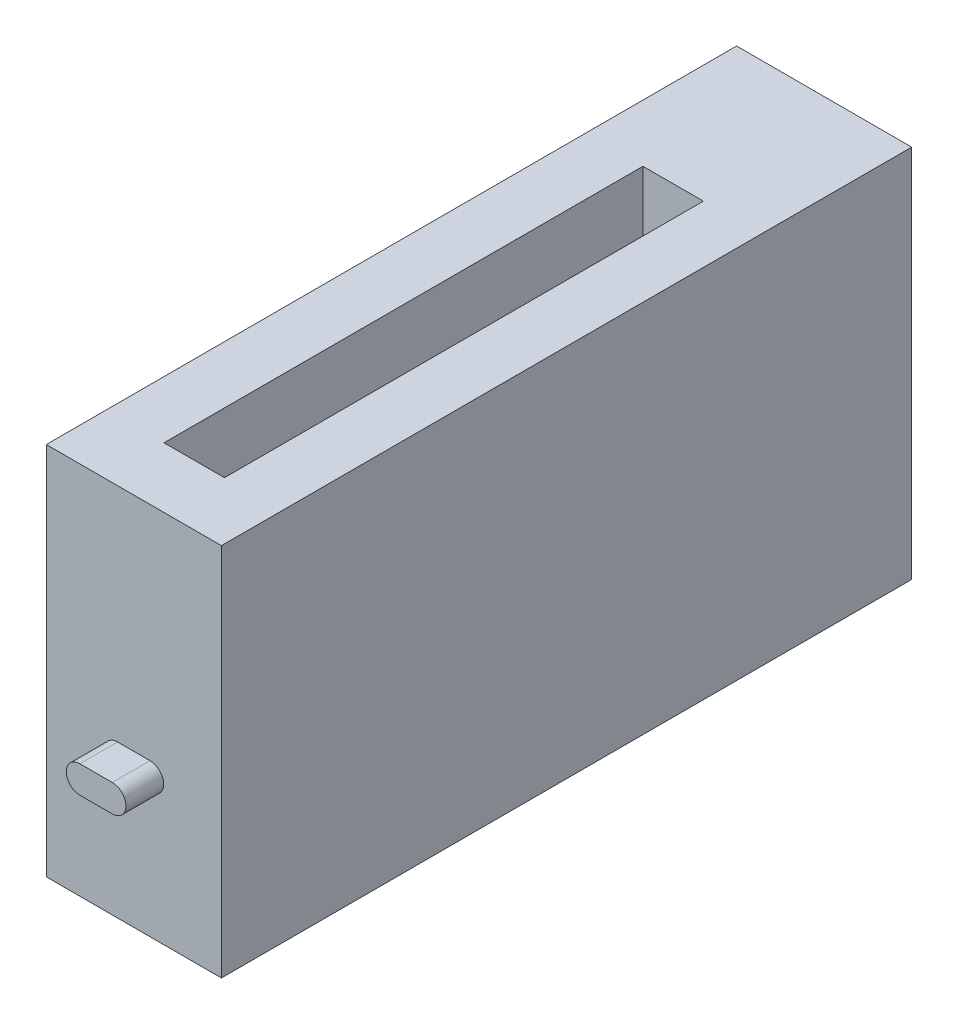
ISO-10303-21;
HEADER;
FILE_DESCRIPTION(('STEP AP214'),'2;1');
FILE_NAME('part.step','',(''),(''),'','','');
FILE_SCHEMA(('AUTOMOTIVE_DESIGN { 1 0 10303 214 1 1 1 1 }'));
ENDSEC;
DATA;
#1=APPLICATION_CONTEXT('core data for automotive mechanical design processes');
#2=APPLICATION_PROTOCOL_DEFINITION('international standard','automotive_design',2000,#1);
#3=PRODUCT_CONTEXT('',#1,'mechanical');
#4=PRODUCT('Part','Part','',(#3));
#5=PRODUCT_RELATED_PRODUCT_CATEGORY('part','',(#4));
#6=PRODUCT_DEFINITION_FORMATION('','',#4);
#7=PRODUCT_DEFINITION_CONTEXT('part definition',#1,'design');
#8=PRODUCT_DEFINITION('design','',#6,#7);
#9=PRODUCT_DEFINITION_SHAPE('','',#8);
#10=(LENGTH_UNIT() NAMED_UNIT(*) SI_UNIT(.MILLI.,.METRE.));
#11=(NAMED_UNIT(*) PLANE_ANGLE_UNIT() SI_UNIT($,.RADIAN.));
#12=(NAMED_UNIT(*) SI_UNIT($,.STERADIAN.) SOLID_ANGLE_UNIT());
#13=UNCERTAINTY_MEASURE_WITH_UNIT(LENGTH_MEASURE(1.E-05),#10,'distance_accuracy_value','');
#14=(GEOMETRIC_REPRESENTATION_CONTEXT(3) GLOBAL_UNCERTAINTY_ASSIGNED_CONTEXT((#13)) GLOBAL_UNIT_ASSIGNED_CONTEXT((#10,
#11,#12)) REPRESENTATION_CONTEXT('',''));
#15=CARTESIAN_POINT('',(0.,0.,0.));
#16=DIRECTION('',(0.,0.,1.));
#17=DIRECTION('',(1.,0.,0.));
#18=AXIS2_PLACEMENT_3D('',#15,#16,#17);
#19=CARTESIAN_POINT('',(-3.683,15.748,14.5161));
#20=DIRECTION('',(0.,0.,-1.));
#21=DIRECTION('',(-1.,0.,0.));
#22=AXIS2_PLACEMENT_3D('',#19,#20,#21);
#23=PLANE('',#22);
#24=DIRECTION('',(1.,0.,0.));
#25=VECTOR('',#24,1.);
#26=CARTESIAN_POINT('',(-3.683,0.,14.5161));
#27=LINE('',#26,#25);
#28=CARTESIAN_POINT('',(-3.683,0.,14.5161));
#29=VERTEX_POINT('',#28);
#30=CARTESIAN_POINT('',(3.683,0.,14.5161));
#31=VERTEX_POINT('',#30);
#32=EDGE_CURVE('E187',#29,#31,#27,.T.);
#33=ORIENTED_EDGE('',*,*,#32,.T.);
#34=DIRECTION('',(0.,-1.,0.));
#35=VECTOR('',#34,1.);
#36=CARTESIAN_POINT('',(3.683,15.748,14.5161));
#37=LINE('',#36,#35);
#38=CARTESIAN_POINT('',(3.683,15.748,14.5161));
#39=VERTEX_POINT('',#38);
#40=EDGE_CURVE('E193',#39,#31,#37,.T.);
#41=ORIENTED_EDGE('',*,*,#40,.F.);
#42=DIRECTION('',(1.,0.,0.));
#43=VECTOR('',#42,1.);
#44=CARTESIAN_POINT('',(-3.683,15.748,14.5161));
#45=LINE('',#44,#43);
#46=CARTESIAN_POINT('',(-3.683,15.748,14.5161));
#47=VERTEX_POINT('',#46);
#48=EDGE_CURVE('E191',#47,#39,#45,.T.);
#49=ORIENTED_EDGE('',*,*,#48,.F.);
#50=DIRECTION('',(0.,-1.,0.));
#51=VECTOR('',#50,1.);
#52=CARTESIAN_POINT('',(-3.683,15.748,14.5161));
#53=LINE('',#52,#51);
#54=EDGE_CURVE('E203',#47,#29,#53,.T.);
#55=ORIENTED_EDGE('',*,*,#54,.T.);
#56=EDGE_LOOP('',(#33,#41,#49,#55));
#57=FACE_BOUND('',#56,.T.);
#58=CARTESIAN_POINT('',(-0.682666256929174,5.842,14.5161));
#59=DIRECTION('',(0.,0.,1.));
#60=DIRECTION('',(1.,0.,0.));
#61=AXIS2_PLACEMENT_3D('',#58,#59,#60);
#62=CIRCLE('',#61,0.572003725186661);
#63=CARTESIAN_POINT('',(-0.682666256929174,6.41400372518666,14.5161));
#64=VERTEX_POINT('',#63);
#65=CARTESIAN_POINT('',(-0.682666256929174,5.26999627481334,14.5161));
#66=VERTEX_POINT('',#65);
#67=EDGE_CURVE('E144',#64,#66,#62,.T.);
#68=ORIENTED_EDGE('',*,*,#67,.F.);
#69=DIRECTION('',(-1.,0.,0.));
#70=VECTOR('',#69,1.);
#71=CARTESIAN_POINT('',(-0.682666256929174,6.41400372518666,14.5161));
#72=LINE('',#71,#70);
#73=CARTESIAN_POINT('',(0.682666256929174,6.41400372518666,14.5161));
#74=VERTEX_POINT('',#73);
#75=EDGE_CURVE('E141',#74,#64,#72,.T.);
#76=ORIENTED_EDGE('',*,*,#75,.F.);
#77=CARTESIAN_POINT('',(0.682666256929174,5.842,14.5161));
#78=DIRECTION('',(0.,0.,1.));
#79=DIRECTION('',(1.,0.,0.));
#80=AXIS2_PLACEMENT_3D('',#77,#78,#79);
#81=CIRCLE('',#80,0.572003725186661);
#82=CARTESIAN_POINT('',(0.682666256929174,5.26999627481334,14.5161));
#83=VERTEX_POINT('',#82);
#84=EDGE_CURVE('E55',#83,#74,#81,.T.);
#85=ORIENTED_EDGE('',*,*,#84,.F.);
#86=DIRECTION('',(1.,0.,0.));
#87=VECTOR('',#86,1.);
#88=CARTESIAN_POINT('',(-0.682666256929174,5.26999627481334,14.5161));
#89=LINE('',#88,#87);
#90=EDGE_CURVE('E50',#66,#83,#89,.T.);
#91=ORIENTED_EDGE('',*,*,#90,.F.);
#92=EDGE_LOOP('',(#68,#76,#85,#91));
#93=FACE_BOUND('',#92,.T.);
#94=ADVANCED_FACE('F35',(#57,#93),#23,.F.);
#95=CARTESIAN_POINT('',(3.683,15.748,14.5161));
#96=DIRECTION('',(-1.,0.,0.));
#97=DIRECTION('',(0.,0.,1.));
#98=AXIS2_PLACEMENT_3D('',#95,#96,#97);
#99=PLANE('',#98);
#100=DIRECTION('',(0.,0.,-1.));
#101=VECTOR('',#100,1.);
#102=CARTESIAN_POINT('',(3.683,0.,14.5161));
#103=LINE('',#102,#101);
#104=CARTESIAN_POINT('',(3.683,0.,-14.5161));
#105=VERTEX_POINT('',#104);
#106=EDGE_CURVE('E176',#31,#105,#103,.T.);
#107=ORIENTED_EDGE('',*,*,#106,.T.);
#108=DIRECTION('',(0.,-1.,0.));
#109=VECTOR('',#108,1.);
#110=CARTESIAN_POINT('',(3.683,15.748,-14.5161));
#111=LINE('',#110,#109);
#112=CARTESIAN_POINT('',(3.683,15.748,-14.5161));
#113=VERTEX_POINT('',#112);
#114=EDGE_CURVE('E11',#113,#105,#111,.T.);
#115=ORIENTED_EDGE('',*,*,#114,.F.);
#116=DIRECTION('',(0.,0.,-1.));
#117=VECTOR('',#116,1.);
#118=CARTESIAN_POINT('',(3.683,15.748,14.5161));
#119=LINE('',#118,#117);
#120=EDGE_CURVE('E183',#39,#113,#119,.T.);
#121=ORIENTED_EDGE('',*,*,#120,.F.);
#122=ORIENTED_EDGE('',*,*,#40,.T.);
#123=EDGE_LOOP('',(#107,#115,#121,#122));
#124=FACE_BOUND('',#123,.T.);
#125=ADVANCED_FACE('F37',(#124),#99,.F.);
#126=CARTESIAN_POINT('',(-3.683,15.748,-14.5161));
#127=DIRECTION('',(0.,0.,1.));
#128=DIRECTION('',(1.,0.,0.));
#129=AXIS2_PLACEMENT_3D('',#126,#127,#128);
#130=PLANE('',#129);
#131=DIRECTION('',(-1.,0.,0.));
#132=VECTOR('',#131,1.);
#133=CARTESIAN_POINT('',(-3.683,0.,-14.5161));
#134=LINE('',#133,#132);
#135=CARTESIAN_POINT('',(-3.683,0.,-14.5161));
#136=VERTEX_POINT('',#135);
#137=EDGE_CURVE('E196',#105,#136,#134,.T.);
#138=ORIENTED_EDGE('',*,*,#137,.T.);
#139=DIRECTION('',(0.,-1.,0.));
#140=VECTOR('',#139,1.);
#141=CARTESIAN_POINT('',(-3.683,15.748,-14.5161));
#142=LINE('',#141,#140);
#143=CARTESIAN_POINT('',(-3.683,15.748,-14.5161));
#144=VERTEX_POINT('',#143);
#145=EDGE_CURVE('E43',#144,#136,#142,.T.);
#146=ORIENTED_EDGE('',*,*,#145,.F.);
#147=DIRECTION('',(-1.,0.,0.));
#148=VECTOR('',#147,1.);
#149=CARTESIAN_POINT('',(-3.683,15.748,-14.5161));
#150=LINE('',#149,#148);
#151=EDGE_CURVE('E186',#113,#144,#150,.T.);
#152=ORIENTED_EDGE('',*,*,#151,.F.);
#153=ORIENTED_EDGE('',*,*,#114,.T.);
#154=EDGE_LOOP('',(#138,#146,#152,#153));
#155=FACE_BOUND('',#154,.T.);
#156=ADVANCED_FACE('F225',(#155),#130,.F.);
#157=CARTESIAN_POINT('',(-3.683,15.748,14.5161));
#158=DIRECTION('',(1.,0.,0.));
#159=DIRECTION('',(0.,0.,-1.));
#160=AXIS2_PLACEMENT_3D('',#157,#158,#159);
#161=PLANE('',#160);
#162=DIRECTION('',(0.,0.,1.));
#163=VECTOR('',#162,1.);
#164=CARTESIAN_POINT('',(-3.683,0.,14.5161));
#165=LINE('',#164,#163);
#166=EDGE_CURVE('E198',#136,#29,#165,.T.);
#167=ORIENTED_EDGE('',*,*,#166,.T.);
#168=ORIENTED_EDGE('',*,*,#54,.F.);
#169=DIRECTION('',(0.,0.,1.));
#170=VECTOR('',#169,1.);
#171=CARTESIAN_POINT('',(-3.683,15.748,14.5161));
#172=LINE('',#171,#170);
#173=EDGE_CURVE('E189',#144,#47,#172,.T.);
#174=ORIENTED_EDGE('',*,*,#173,.F.);
#175=ORIENTED_EDGE('',*,*,#145,.T.);
#176=EDGE_LOOP('',(#167,#168,#174,#175));
#177=FACE_BOUND('',#176,.T.);
#178=ADVANCED_FACE('F210',(#177),#161,.F.);
#179=CARTESIAN_POINT('',(0.,15.748,0.));
#180=DIRECTION('',(0.,-1.,0.));
#181=DIRECTION('',(0.,0.,-1.));
#182=AXIS2_PLACEMENT_3D('',#179,#180,#181);
#183=PLANE('',#182);
#184=DIRECTION('',(-1.,0.,0.));
#185=VECTOR('',#184,1.);
#186=CARTESIAN_POINT('',(-1.27,15.748,-8.1661));
#187=LINE('',#186,#185);
#188=CARTESIAN_POINT('',(1.27,15.748,-8.1661));
#189=VERTEX_POINT('',#188);
#190=CARTESIAN_POINT('',(-1.27,15.748,-8.1661));
#191=VERTEX_POINT('',#190);
#192=EDGE_CURVE('E147',#189,#191,#187,.T.);
#193=ORIENTED_EDGE('',*,*,#192,.F.);
#194=DIRECTION('',(0.,0.,-1.));
#195=VECTOR('',#194,1.);
#196=CARTESIAN_POINT('',(1.27,15.748,11.9761));
#197=LINE('',#196,#195);
#198=CARTESIAN_POINT('',(1.27,15.748,11.9761));
#199=VERTEX_POINT('',#198);
#200=EDGE_CURVE('E145',#199,#189,#197,.T.);
#201=ORIENTED_EDGE('',*,*,#200,.F.);
#202=DIRECTION('',(1.,0.,0.));
#203=VECTOR('',#202,1.);
#204=CARTESIAN_POINT('',(-1.27,15.748,11.9761));
#205=LINE('',#204,#203);
#206=CARTESIAN_POINT('',(-1.27,15.748,11.9761));
#207=VERTEX_POINT('',#206);
#208=EDGE_CURVE('E157',#207,#199,#205,.T.);
#209=ORIENTED_EDGE('',*,*,#208,.F.);
#210=DIRECTION('',(0.,0.,1.));
#211=VECTOR('',#210,1.);
#212=CARTESIAN_POINT('',(-1.27,15.748,11.9761));
#213=LINE('',#212,#211);
#214=EDGE_CURVE('E169',#191,#207,#213,.T.);
#215=ORIENTED_EDGE('',*,*,#214,.F.);
#216=EDGE_LOOP('',(#193,#201,#209,#215));
#217=FACE_BOUND('',#216,.T.);
#218=ORIENTED_EDGE('',*,*,#120,.T.);
#219=ORIENTED_EDGE('',*,*,#151,.T.);
#220=ORIENTED_EDGE('',*,*,#173,.T.);
#221=ORIENTED_EDGE('',*,*,#48,.T.);
#222=EDGE_LOOP('',(#218,#219,#220,#221));
#223=FACE_BOUND('',#222,.T.);
#224=ADVANCED_FACE('F224',(#217,#223),#183,.F.);
#225=CARTESIAN_POINT('',(0.,0.,0.));
#226=DIRECTION('',(0.,-1.,0.));
#227=DIRECTION('',(0.,0.,-1.));
#228=AXIS2_PLACEMENT_3D('',#225,#226,#227);
#229=PLANE('',#228);
#230=ORIENTED_EDGE('',*,*,#106,.F.);
#231=ORIENTED_EDGE('',*,*,#32,.F.);
#232=ORIENTED_EDGE('',*,*,#166,.F.);
#233=ORIENTED_EDGE('',*,*,#137,.F.);
#234=EDGE_LOOP('',(#230,#231,#232,#233));
#235=FACE_BOUND('',#234,.T.);
#236=ADVANCED_FACE('F216',(#235),#229,.T.);
#237=CARTESIAN_POINT('',(1.27,12.573,11.9761));
#238=DIRECTION('',(1.,0.,0.));
#239=DIRECTION('',(0.,0.,-1.));
#240=AXIS2_PLACEMENT_3D('',#237,#238,#239);
#241=PLANE('',#240);
#242=ORIENTED_EDGE('',*,*,#200,.T.);
#243=DIRECTION('',(0.,1.,0.));
#244=VECTOR('',#243,1.);
#245=CARTESIAN_POINT('',(1.27,12.573,-8.1661));
#246=LINE('',#245,#244);
#247=CARTESIAN_POINT('',(1.27,12.573,-8.1661));
#248=VERTEX_POINT('',#247);
#249=EDGE_CURVE('E165',#248,#189,#246,.T.);
#250=ORIENTED_EDGE('',*,*,#249,.F.);
#251=DIRECTION('',(0.,0.,-1.));
#252=VECTOR('',#251,1.);
#253=CARTESIAN_POINT('',(1.27,12.573,11.9761));
#254=LINE('',#253,#252);
#255=CARTESIAN_POINT('',(1.27,12.573,11.9761));
#256=VERTEX_POINT('',#255);
#257=EDGE_CURVE('E153',#256,#248,#254,.T.);
#258=ORIENTED_EDGE('',*,*,#257,.F.);
#259=DIRECTION('',(0.,1.,0.));
#260=VECTOR('',#259,1.);
#261=CARTESIAN_POINT('',(1.27,12.573,11.9761));
#262=LINE('',#261,#260);
#263=EDGE_CURVE('E174',#256,#199,#262,.T.);
#264=ORIENTED_EDGE('',*,*,#263,.T.);
#265=EDGE_LOOP('',(#242,#250,#258,#264));
#266=FACE_BOUND('',#265,.T.);
#267=ADVANCED_FACE('F239',(#266),#241,.F.);
#268=CARTESIAN_POINT('',(-1.27,12.573,11.9761));
#269=DIRECTION('',(0.,0.,1.));
#270=DIRECTION('',(1.,0.,0.));
#271=AXIS2_PLACEMENT_3D('',#268,#269,#270);
#272=PLANE('',#271);
#273=ORIENTED_EDGE('',*,*,#208,.T.);
#274=ORIENTED_EDGE('',*,*,#263,.F.);
#275=DIRECTION('',(1.,0.,0.));
#276=VECTOR('',#275,1.);
#277=CARTESIAN_POINT('',(-1.27,12.573,11.9761));
#278=LINE('',#277,#276);
#279=CARTESIAN_POINT('',(-1.27,12.573,11.9761));
#280=VERTEX_POINT('',#279);
#281=EDGE_CURVE('E163',#280,#256,#278,.T.);
#282=ORIENTED_EDGE('',*,*,#281,.F.);
#283=DIRECTION('',(0.,1.,0.));
#284=VECTOR('',#283,1.);
#285=CARTESIAN_POINT('',(-1.27,12.573,11.9761));
#286=LINE('',#285,#284);
#287=EDGE_CURVE('E177',#280,#207,#286,.T.);
#288=ORIENTED_EDGE('',*,*,#287,.T.);
#289=EDGE_LOOP('',(#273,#274,#282,#288));
#290=FACE_BOUND('',#289,.T.);
#291=ADVANCED_FACE('F245',(#290),#272,.F.);
#292=CARTESIAN_POINT('',(-1.27,12.573,11.9761));
#293=DIRECTION('',(-1.,0.,0.));
#294=DIRECTION('',(0.,0.,1.));
#295=AXIS2_PLACEMENT_3D('',#292,#293,#294);
#296=PLANE('',#295);
#297=ORIENTED_EDGE('',*,*,#214,.T.);
#298=ORIENTED_EDGE('',*,*,#287,.F.);
#299=DIRECTION('',(0.,0.,1.));
#300=VECTOR('',#299,1.);
#301=CARTESIAN_POINT('',(-1.27,12.573,11.9761));
#302=LINE('',#301,#300);
#303=CARTESIAN_POINT('',(-1.27,12.573,-8.1661));
#304=VERTEX_POINT('',#303);
#305=EDGE_CURVE('E160',#304,#280,#302,.T.);
#306=ORIENTED_EDGE('',*,*,#305,.F.);
#307=DIRECTION('',(0.,1.,0.));
#308=VECTOR('',#307,1.);
#309=CARTESIAN_POINT('',(-1.27,12.573,-8.1661));
#310=LINE('',#309,#308);
#311=EDGE_CURVE('E179',#304,#191,#310,.T.);
#312=ORIENTED_EDGE('',*,*,#311,.T.);
#313=EDGE_LOOP('',(#297,#298,#306,#312));
#314=FACE_BOUND('',#313,.T.);
#315=ADVANCED_FACE('F251',(#314),#296,.F.);
#316=CARTESIAN_POINT('',(-1.27,12.573,-8.1661));
#317=DIRECTION('',(0.,0.,-1.));
#318=DIRECTION('',(-1.,0.,0.));
#319=AXIS2_PLACEMENT_3D('',#316,#317,#318);
#320=PLANE('',#319);
#321=ORIENTED_EDGE('',*,*,#192,.T.);
#322=ORIENTED_EDGE('',*,*,#311,.F.);
#323=DIRECTION('',(-1.,0.,0.));
#324=VECTOR('',#323,1.);
#325=CARTESIAN_POINT('',(-1.27,12.573,-8.1661));
#326=LINE('',#325,#324);
#327=EDGE_CURVE('E156',#248,#304,#326,.T.);
#328=ORIENTED_EDGE('',*,*,#327,.F.);
#329=ORIENTED_EDGE('',*,*,#249,.T.);
#330=EDGE_LOOP('',(#321,#322,#328,#329));
#331=FACE_BOUND('',#330,.T.);
#332=ADVANCED_FACE('F247',(#331),#320,.F.);
#333=CARTESIAN_POINT('',(0.,12.573,0.));
#334=DIRECTION('',(0.,-1.,0.));
#335=DIRECTION('',(0.,0.,-1.));
#336=AXIS2_PLACEMENT_3D('',#333,#334,#335);
#337=PLANE('',#336);
#338=ORIENTED_EDGE('',*,*,#257,.T.);
#339=ORIENTED_EDGE('',*,*,#327,.T.);
#340=ORIENTED_EDGE('',*,*,#305,.T.);
#341=ORIENTED_EDGE('',*,*,#281,.T.);
#342=EDGE_LOOP('',(#338,#339,#340,#341));
#343=FACE_BOUND('',#342,.T.);
#344=ADVANCED_FACE('F250',(#343),#337,.F.);
#345=CARTESIAN_POINT('',(-0.682666256929174,5.842,16.1036));
#346=DIRECTION('',(0.,0.,-1.));
#347=DIRECTION('',(-1.,0.,0.));
#348=AXIS2_PLACEMENT_3D('',#345,#346,#347);
#349=CYLINDRICAL_SURFACE('',#348,0.572003725186661);
#350=ORIENTED_EDGE('',*,*,#67,.T.);
#351=DIRECTION('',(0.,0.,-1.));
#352=VECTOR('',#351,1.);
#353=CARTESIAN_POINT('',(-0.682666256929174,5.26999627481334,16.1036));
#354=LINE('',#353,#352);
#355=CARTESIAN_POINT('',(-0.682666256929174,5.26999627481334,16.1036));
#356=VERTEX_POINT('',#355);
#357=EDGE_CURVE('E125',#356,#66,#354,.T.);
#358=ORIENTED_EDGE('',*,*,#357,.F.);
#359=CARTESIAN_POINT('',(-0.682666256929174,5.842,16.1036));
#360=DIRECTION('',(0.,0.,1.));
#361=DIRECTION('',(1.,0.,0.));
#362=AXIS2_PLACEMENT_3D('',#359,#360,#361);
#363=CIRCLE('',#362,0.572003725186661);
#364=CARTESIAN_POINT('',(-0.682666256929174,6.41400372518666,16.1036));
#365=VERTEX_POINT('',#364);
#366=EDGE_CURVE('E132',#365,#356,#363,.T.);
#367=ORIENTED_EDGE('',*,*,#366,.F.);
#368=DIRECTION('',(0.,0.,-1.));
#369=VECTOR('',#368,1.);
#370=CARTESIAN_POINT('',(-0.682666256929174,6.41400372518666,16.1036));
#371=LINE('',#370,#369);
#372=EDGE_CURVE('E379',#365,#64,#371,.T.);
#373=ORIENTED_EDGE('',*,*,#372,.T.);
#374=EDGE_LOOP('',(#350,#358,#367,#373));
#375=FACE_BOUND('',#374,.T.);
#376=ADVANCED_FACE('F143',(#375),#349,.T.);
#377=CARTESIAN_POINT('',(-0.682666256929174,5.26999627481334,16.1036));
#378=DIRECTION('',(0.,1.,0.));
#379=DIRECTION('',(0.,0.,1.));
#380=AXIS2_PLACEMENT_3D('',#377,#378,#379);
#381=PLANE('',#380);
#382=ORIENTED_EDGE('',*,*,#90,.T.);
#383=DIRECTION('',(0.,0.,-1.));
#384=VECTOR('',#383,1.);
#385=CARTESIAN_POINT('',(0.682666256929174,5.26999627481334,16.1036));
#386=LINE('',#385,#384);
#387=CARTESIAN_POINT('',(0.682666256929174,5.26999627481334,16.1036));
#388=VERTEX_POINT('',#387);
#389=EDGE_CURVE('E128',#388,#83,#386,.T.);
#390=ORIENTED_EDGE('',*,*,#389,.F.);
#391=DIRECTION('',(1.,0.,0.));
#392=VECTOR('',#391,1.);
#393=CARTESIAN_POINT('',(-0.682666256929174,5.26999627481334,16.1036));
#394=LINE('',#393,#392);
#395=EDGE_CURVE('E121',#356,#388,#394,.T.);
#396=ORIENTED_EDGE('',*,*,#395,.F.);
#397=ORIENTED_EDGE('',*,*,#357,.T.);
#398=EDGE_LOOP('',(#382,#390,#396,#397));
#399=FACE_BOUND('',#398,.T.);
#400=ADVANCED_FACE('F123',(#399),#381,.F.);
#401=CARTESIAN_POINT('',(0.682666256929174,5.842,16.1036));
#402=DIRECTION('',(0.,0.,-1.));
#403=DIRECTION('',(-1.,0.,0.));
#404=AXIS2_PLACEMENT_3D('',#401,#402,#403);
#405=CYLINDRICAL_SURFACE('',#404,0.572003725186661);
#406=ORIENTED_EDGE('',*,*,#84,.T.);
#407=DIRECTION('',(0.,0.,-1.));
#408=VECTOR('',#407,1.);
#409=CARTESIAN_POINT('',(0.682666256929174,6.41400372518666,16.1036));
#410=LINE('',#409,#408);
#411=CARTESIAN_POINT('',(0.682666256929174,6.41400372518666,16.1036));
#412=VERTEX_POINT('',#411);
#413=EDGE_CURVE('E149',#412,#74,#410,.T.);
#414=ORIENTED_EDGE('',*,*,#413,.F.);
#415=CARTESIAN_POINT('',(0.682666256929174,5.842,16.1036));
#416=DIRECTION('',(0.,0.,1.));
#417=DIRECTION('',(1.,0.,0.));
#418=AXIS2_PLACEMENT_3D('',#415,#416,#417);
#419=CIRCLE('',#418,0.572003725186661);
#420=EDGE_CURVE('E131',#388,#412,#419,.T.);
#421=ORIENTED_EDGE('',*,*,#420,.F.);
#422=ORIENTED_EDGE('',*,*,#389,.T.);
#423=EDGE_LOOP('',(#406,#414,#421,#422));
#424=FACE_BOUND('',#423,.T.);
#425=ADVANCED_FACE('F266',(#424),#405,.T.);
#426=CARTESIAN_POINT('',(-0.682666256929174,6.41400372518666,16.1036));
#427=DIRECTION('',(0.,-1.,0.));
#428=DIRECTION('',(0.,0.,-1.));
#429=AXIS2_PLACEMENT_3D('',#426,#427,#428);
#430=PLANE('',#429);
#431=ORIENTED_EDGE('',*,*,#75,.T.);
#432=ORIENTED_EDGE('',*,*,#372,.F.);
#433=DIRECTION('',(-1.,0.,0.));
#434=VECTOR('',#433,1.);
#435=CARTESIAN_POINT('',(-0.682666256929174,6.41400372518666,16.1036));
#436=LINE('',#435,#434);
#437=EDGE_CURVE('E137',#412,#365,#436,.T.);
#438=ORIENTED_EDGE('',*,*,#437,.F.);
#439=ORIENTED_EDGE('',*,*,#413,.T.);
#440=EDGE_LOOP('',(#431,#432,#438,#439));
#441=FACE_BOUND('',#440,.T.);
#442=ADVANCED_FACE('F269',(#441),#430,.F.);
#443=CARTESIAN_POINT('',(-0.682666256929174,5.842,16.1036));
#444=DIRECTION('',(0.,0.,1.));
#445=DIRECTION('',(1.,0.,0.));
#446=AXIS2_PLACEMENT_3D('',#443,#444,#445);
#447=PLANE('',#446);
#448=ORIENTED_EDGE('',*,*,#366,.T.);
#449=ORIENTED_EDGE('',*,*,#395,.T.);
#450=ORIENTED_EDGE('',*,*,#420,.T.);
#451=ORIENTED_EDGE('',*,*,#437,.T.);
#452=EDGE_LOOP('',(#448,#449,#450,#451));
#453=FACE_BOUND('',#452,.T.);
#454=ADVANCED_FACE('F135',(#453),#447,.T.);
#455=CLOSED_SHELL('',(#94,#125,#156,#178,#224,#236,#267,#291,#315,#332,#344,#376,#400,#425,#442,#454));
#456=MANIFOLD_SOLID_BREP('B2',#455);
#457=ADVANCED_BREP_SHAPE_REPRESENTATION('',(#18,#456),#14);
#458=SHAPE_DEFINITION_REPRESENTATION(#9,#457);
ENDSEC;
END-ISO-10303-21;
